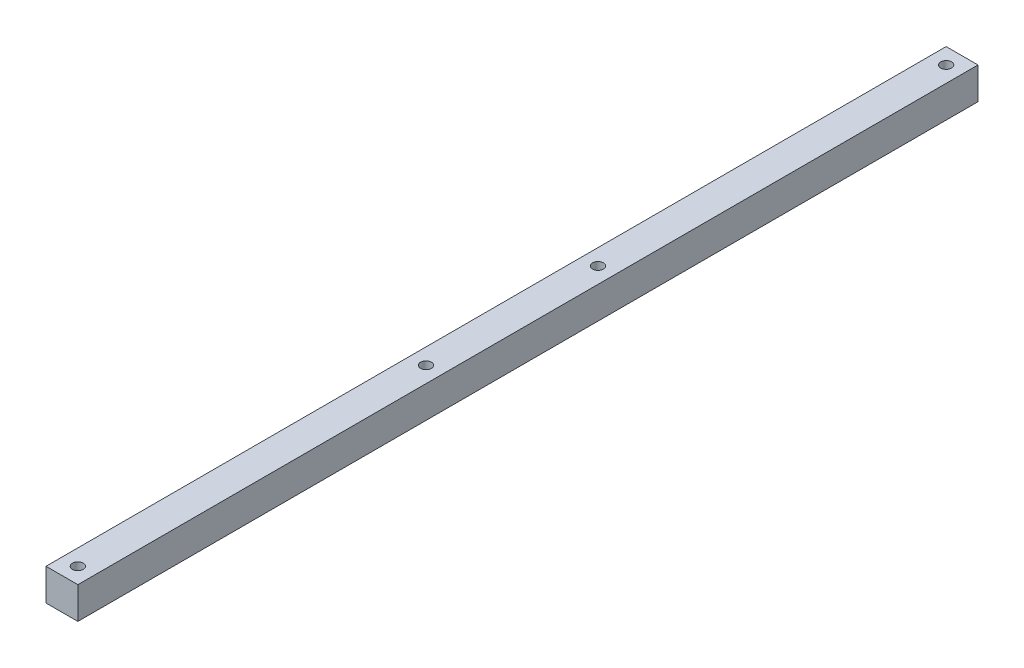
ISO-10303-21;
HEADER;
FILE_DESCRIPTION(('STEP AP214'),'2;1');
FILE_NAME('part.step','',(''),(''),'','','');
FILE_SCHEMA(('AUTOMOTIVE_DESIGN { 1 0 10303 214 1 1 1 1 }'));
ENDSEC;
DATA;
#1=APPLICATION_CONTEXT('core data for automotive mechanical design processes');
#2=APPLICATION_PROTOCOL_DEFINITION('international standard','automotive_design',2000,#1);
#3=PRODUCT_CONTEXT('',#1,'mechanical');
#4=PRODUCT('Part','Part','',(#3));
#5=PRODUCT_RELATED_PRODUCT_CATEGORY('part','',(#4));
#6=PRODUCT_DEFINITION_FORMATION('','',#4);
#7=PRODUCT_DEFINITION_CONTEXT('part definition',#1,'design');
#8=PRODUCT_DEFINITION('design','',#6,#7);
#9=PRODUCT_DEFINITION_SHAPE('','',#8);
#10=(LENGTH_UNIT() NAMED_UNIT(*) SI_UNIT(.MILLI.,.METRE.));
#11=(NAMED_UNIT(*) PLANE_ANGLE_UNIT() SI_UNIT($,.RADIAN.));
#12=(NAMED_UNIT(*) SI_UNIT($,.STERADIAN.) SOLID_ANGLE_UNIT());
#13=UNCERTAINTY_MEASURE_WITH_UNIT(LENGTH_MEASURE(1.E-05),#10,'distance_accuracy_value','');
#14=(GEOMETRIC_REPRESENTATION_CONTEXT(3) GLOBAL_UNCERTAINTY_ASSIGNED_CONTEXT((#13)) GLOBAL_UNIT_ASSIGNED_CONTEXT((#10,
#11,#12)) REPRESENTATION_CONTEXT('',''));
#15=CARTESIAN_POINT('',(0.,0.,0.));
#16=DIRECTION('',(0.,0.,1.));
#17=DIRECTION('',(1.,0.,0.));
#18=AXIS2_PLACEMENT_3D('',#15,#16,#17);
#19=CARTESIAN_POINT('',(2.5,-2.5,141.3));
#20=DIRECTION('',(-1.,0.,0.));
#21=DIRECTION('',(0.,0.,1.));
#22=AXIS2_PLACEMENT_3D('',#19,#20,#21);
#23=PLANE('',#22);
#24=DIRECTION('',(0.,1.,0.));
#25=VECTOR('',#24,1.);
#26=CARTESIAN_POINT('',(2.5,-2.5,0.));
#27=LINE('',#26,#25);
#28=CARTESIAN_POINT('',(2.5,-2.5,0.));
#29=VERTEX_POINT('',#28);
#30=CARTESIAN_POINT('',(2.5,2.5,0.));
#31=VERTEX_POINT('',#30);
#32=EDGE_CURVE('E107',#29,#31,#27,.T.);
#33=ORIENTED_EDGE('',*,*,#32,.T.);
#34=DIRECTION('',(0.,0.,-1.));
#35=VECTOR('',#34,1.);
#36=CARTESIAN_POINT('',(2.5,2.5,141.3));
#37=LINE('',#36,#35);
#38=CARTESIAN_POINT('',(2.5,2.5,141.3));
#39=VERTEX_POINT('',#38);
#40=EDGE_CURVE('E11',#39,#31,#37,.T.);
#41=ORIENTED_EDGE('',*,*,#40,.F.);
#42=DIRECTION('',(0.,1.,0.));
#43=VECTOR('',#42,1.);
#44=CARTESIAN_POINT('',(2.5,-2.5,141.3));
#45=LINE('',#44,#43);
#46=CARTESIAN_POINT('',(2.5,-2.5,141.3));
#47=VERTEX_POINT('',#46);
#48=EDGE_CURVE('E91',#47,#39,#45,.T.);
#49=ORIENTED_EDGE('',*,*,#48,.F.);
#50=DIRECTION('',(0.,0.,-1.));
#51=VECTOR('',#50,1.);
#52=CARTESIAN_POINT('',(2.5,-2.5,141.3));
#53=LINE('',#52,#51);
#54=EDGE_CURVE('E103',#47,#29,#53,.T.);
#55=ORIENTED_EDGE('',*,*,#54,.T.);
#56=EDGE_LOOP('',(#33,#41,#49,#55));
#57=FACE_BOUND('',#56,.T.);
#58=ADVANCED_FACE('F39',(#57),#23,.F.);
#59=CARTESIAN_POINT('',(-2.5,2.5,141.3));
#60=DIRECTION('',(0.,-1.,0.));
#61=DIRECTION('',(0.,0.,-1.));
#62=AXIS2_PLACEMENT_3D('',#59,#60,#61);
#63=PLANE('',#62);
#64=CARTESIAN_POINT('',(0.,2.5,138.8));
#65=DIRECTION('',(0.,-1.,0.));
#66=DIRECTION('',(0.,0.,-1.));
#67=AXIS2_PLACEMENT_3D('',#64,#65,#66);
#68=CIRCLE('',#67,0.849999999999994);
#69=CARTESIAN_POINT('',(0.,2.5,137.95));
#70=VERTEX_POINT('',#69);
#71=EDGE_CURVE('E111',#70,#70,#68,.T.);
#72=ORIENTED_EDGE('',*,*,#71,.T.);
#73=EDGE_LOOP('',(#72));
#74=FACE_BOUND('',#73,.T.);
#75=CARTESIAN_POINT('',(0.,2.5,57.15));
#76=DIRECTION('',(0.,-1.,0.));
#77=DIRECTION('',(0.,0.,1.));
#78=AXIS2_PLACEMENT_3D('',#75,#76,#77);
#79=CIRCLE('',#78,0.850000000000002);
#80=CARTESIAN_POINT('',(0.,2.5,58.));
#81=VERTEX_POINT('',#80);
#82=EDGE_CURVE('E133',#81,#81,#79,.T.);
#83=ORIENTED_EDGE('',*,*,#82,.T.);
#84=EDGE_LOOP('',(#83));
#85=FACE_BOUND('',#84,.T.);
#86=CARTESIAN_POINT('',(0.,2.5,84.15));
#87=DIRECTION('',(0.,-1.,0.));
#88=DIRECTION('',(0.,0.,-1.));
#89=AXIS2_PLACEMENT_3D('',#86,#87,#88);
#90=CIRCLE('',#89,0.850000000000002);
#91=CARTESIAN_POINT('',(0.,2.5,83.3));
#92=VERTEX_POINT('',#91);
#93=EDGE_CURVE('E132',#92,#92,#90,.T.);
#94=ORIENTED_EDGE('',*,*,#93,.T.);
#95=EDGE_LOOP('',(#94));
#96=FACE_BOUND('',#95,.T.);
#97=CARTESIAN_POINT('',(0.,2.5,2.5));
#98=DIRECTION('',(0.,-1.,0.));
#99=DIRECTION('',(0.,0.,1.));
#100=AXIS2_PLACEMENT_3D('',#97,#98,#99);
#101=CIRCLE('',#100,0.849999999999994);
#102=CARTESIAN_POINT('',(0.,2.5,3.35));
#103=VERTEX_POINT('',#102);
#104=EDGE_CURVE('E141',#103,#103,#101,.T.);
#105=ORIENTED_EDGE('',*,*,#104,.T.);
#106=EDGE_LOOP('',(#105));
#107=FACE_BOUND('',#106,.T.);
#108=DIRECTION('',(-1.,0.,0.));
#109=VECTOR('',#108,1.);
#110=CARTESIAN_POINT('',(-2.5,2.5,0.));
#111=LINE('',#110,#109);
#112=CARTESIAN_POINT('',(-2.5,2.5,0.));
#113=VERTEX_POINT('',#112);
#114=EDGE_CURVE('E96',#31,#113,#111,.T.);
#115=ORIENTED_EDGE('',*,*,#114,.T.);
#116=DIRECTION('',(0.,0.,-1.));
#117=VECTOR('',#116,1.);
#118=CARTESIAN_POINT('',(-2.5,2.5,141.3));
#119=LINE('',#118,#117);
#120=CARTESIAN_POINT('',(-2.5,2.5,141.3));
#121=VERTEX_POINT('',#120);
#122=EDGE_CURVE('E48',#121,#113,#119,.T.);
#123=ORIENTED_EDGE('',*,*,#122,.F.);
#124=DIRECTION('',(-1.,0.,0.));
#125=VECTOR('',#124,1.);
#126=CARTESIAN_POINT('',(-2.5,2.5,141.3));
#127=LINE('',#126,#125);
#128=EDGE_CURVE('E86',#39,#121,#127,.T.);
#129=ORIENTED_EDGE('',*,*,#128,.F.);
#130=ORIENTED_EDGE('',*,*,#40,.T.);
#131=EDGE_LOOP('',(#115,#123,#129,#130));
#132=FACE_BOUND('',#131,.T.);
#133=ADVANCED_FACE('F95',(#74,#85,#96,#107,#132),#63,.F.);
#134=CARTESIAN_POINT('',(-2.5,-2.5,141.3));
#135=DIRECTION('',(1.,0.,0.));
#136=DIRECTION('',(0.,0.,-1.));
#137=AXIS2_PLACEMENT_3D('',#134,#135,#136);
#138=PLANE('',#137);
#139=DIRECTION('',(0.,-1.,0.));
#140=VECTOR('',#139,1.);
#141=CARTESIAN_POINT('',(-2.5,-2.5,0.));
#142=LINE('',#141,#140);
#143=CARTESIAN_POINT('',(-2.5,-2.5,0.));
#144=VERTEX_POINT('',#143);
#145=EDGE_CURVE('E73',#113,#144,#142,.T.);
#146=ORIENTED_EDGE('',*,*,#145,.T.);
#147=DIRECTION('',(0.,0.,-1.));
#148=VECTOR('',#147,1.);
#149=CARTESIAN_POINT('',(-2.5,-2.5,141.3));
#150=LINE('',#149,#148);
#151=CARTESIAN_POINT('',(-2.5,-2.5,141.3));
#152=VERTEX_POINT('',#151);
#153=EDGE_CURVE('E98',#152,#144,#150,.T.);
#154=ORIENTED_EDGE('',*,*,#153,.F.);
#155=DIRECTION('',(0.,-1.,0.));
#156=VECTOR('',#155,1.);
#157=CARTESIAN_POINT('',(-2.5,-2.5,141.3));
#158=LINE('',#157,#156);
#159=EDGE_CURVE('E89',#121,#152,#158,.T.);
#160=ORIENTED_EDGE('',*,*,#159,.F.);
#161=ORIENTED_EDGE('',*,*,#122,.T.);
#162=EDGE_LOOP('',(#146,#154,#160,#161));
#163=FACE_BOUND('',#162,.T.);
#164=ADVANCED_FACE('F99',(#163),#138,.F.);
#165=CARTESIAN_POINT('',(-2.5,-2.5,141.3));
#166=DIRECTION('',(0.,1.,0.));
#167=DIRECTION('',(0.,0.,1.));
#168=AXIS2_PLACEMENT_3D('',#165,#166,#167);
#169=PLANE('',#168);
#170=CARTESIAN_POINT('',(0.,-2.5,138.8));
#171=DIRECTION('',(0.,-1.,0.));
#172=DIRECTION('',(0.,0.,-1.));
#173=AXIS2_PLACEMENT_3D('',#170,#171,#172);
#174=CIRCLE('',#173,0.849999999999994);
#175=CARTESIAN_POINT('',(0.,-2.5,137.95));
#176=VERTEX_POINT('',#175);
#177=EDGE_CURVE('E145',#176,#176,#174,.T.);
#178=ORIENTED_EDGE('',*,*,#177,.F.);
#179=EDGE_LOOP('',(#178));
#180=FACE_BOUND('',#179,.T.);
#181=CARTESIAN_POINT('',(0.,-2.5,57.15));
#182=DIRECTION('',(0.,-1.,0.));
#183=DIRECTION('',(0.,0.,1.));
#184=AXIS2_PLACEMENT_3D('',#181,#182,#183);
#185=CIRCLE('',#184,0.850000000000002);
#186=CARTESIAN_POINT('',(0.,-2.5,58.));
#187=VERTEX_POINT('',#186);
#188=EDGE_CURVE('E146',#187,#187,#185,.T.);
#189=ORIENTED_EDGE('',*,*,#188,.F.);
#190=EDGE_LOOP('',(#189));
#191=FACE_BOUND('',#190,.T.);
#192=CARTESIAN_POINT('',(0.,-2.5,84.15));
#193=DIRECTION('',(0.,-1.,0.));
#194=DIRECTION('',(0.,0.,-1.));
#195=AXIS2_PLACEMENT_3D('',#192,#193,#194);
#196=CIRCLE('',#195,0.850000000000002);
#197=CARTESIAN_POINT('',(0.,-2.5,83.3));
#198=VERTEX_POINT('',#197);
#199=EDGE_CURVE('E128',#198,#198,#196,.T.);
#200=ORIENTED_EDGE('',*,*,#199,.F.);
#201=EDGE_LOOP('',(#200));
#202=FACE_BOUND('',#201,.T.);
#203=CARTESIAN_POINT('',(0.,-2.5,2.5));
#204=DIRECTION('',(0.,-1.,0.));
#205=DIRECTION('',(0.,0.,1.));
#206=AXIS2_PLACEMENT_3D('',#203,#204,#205);
#207=CIRCLE('',#206,0.849999999999994);
#208=CARTESIAN_POINT('',(0.,-2.5,3.35));
#209=VERTEX_POINT('',#208);
#210=EDGE_CURVE('E137',#209,#209,#207,.T.);
#211=ORIENTED_EDGE('',*,*,#210,.F.);
#212=EDGE_LOOP('',(#211));
#213=FACE_BOUND('',#212,.T.);
#214=DIRECTION('',(1.,0.,0.));
#215=VECTOR('',#214,1.);
#216=CARTESIAN_POINT('',(-2.5,-2.5,0.));
#217=LINE('',#216,#215);
#218=EDGE_CURVE('E79',#144,#29,#217,.T.);
#219=ORIENTED_EDGE('',*,*,#218,.T.);
#220=ORIENTED_EDGE('',*,*,#54,.F.);
#221=DIRECTION('',(1.,0.,0.));
#222=VECTOR('',#221,1.);
#223=CARTESIAN_POINT('',(-2.5,-2.5,141.3));
#224=LINE('',#223,#222);
#225=EDGE_CURVE('E56',#152,#47,#224,.T.);
#226=ORIENTED_EDGE('',*,*,#225,.F.);
#227=ORIENTED_EDGE('',*,*,#153,.T.);
#228=EDGE_LOOP('',(#219,#220,#226,#227));
#229=FACE_BOUND('',#228,.T.);
#230=ADVANCED_FACE('F121',(#180,#191,#202,#213,#229),#169,.F.);
#231=CARTESIAN_POINT('',(0.,0.,141.3));
#232=DIRECTION('',(0.,0.,-1.));
#233=DIRECTION('',(-1.,0.,0.));
#234=AXIS2_PLACEMENT_3D('',#231,#232,#233);
#235=PLANE('',#234);
#236=ORIENTED_EDGE('',*,*,#48,.T.);
#237=ORIENTED_EDGE('',*,*,#128,.T.);
#238=ORIENTED_EDGE('',*,*,#159,.T.);
#239=ORIENTED_EDGE('',*,*,#225,.T.);
#240=EDGE_LOOP('',(#236,#237,#238,#239));
#241=FACE_BOUND('',#240,.T.);
#242=ADVANCED_FACE('F87',(#241),#235,.F.);
#243=CARTESIAN_POINT('',(0.,0.,0.));
#244=DIRECTION('',(0.,0.,-1.));
#245=DIRECTION('',(-1.,0.,0.));
#246=AXIS2_PLACEMENT_3D('',#243,#244,#245);
#247=PLANE('',#246);
#248=ORIENTED_EDGE('',*,*,#32,.F.);
#249=ORIENTED_EDGE('',*,*,#218,.F.);
#250=ORIENTED_EDGE('',*,*,#145,.F.);
#251=ORIENTED_EDGE('',*,*,#114,.F.);
#252=EDGE_LOOP('',(#248,#249,#250,#251));
#253=FACE_BOUND('',#252,.T.);
#254=ADVANCED_FACE('F124',(#253),#247,.T.);
#255=CARTESIAN_POINT('',(0.,2.5,2.5));
#256=DIRECTION('',(0.,-1.,0.));
#257=DIRECTION('',(0.,0.,-1.));
#258=AXIS2_PLACEMENT_3D('',#255,#256,#257);
#259=CYLINDRICAL_SURFACE('',#258,0.849999999999994);
#260=ORIENTED_EDGE('',*,*,#104,.F.);
#261=EDGE_LOOP('',(#260));
#262=FACE_BOUND('',#261,.T.);
#263=ORIENTED_EDGE('',*,*,#210,.T.);
#264=EDGE_LOOP('',(#263));
#265=FACE_BOUND('',#264,.T.);
#266=ADVANCED_FACE('F178',(#262,#265),#259,.F.);
#267=CARTESIAN_POINT('',(0.,2.5,84.15));
#268=DIRECTION('',(0.,-1.,0.));
#269=DIRECTION('',(0.,0.,-1.));
#270=AXIS2_PLACEMENT_3D('',#267,#268,#269);
#271=CYLINDRICAL_SURFACE('',#270,0.850000000000002);
#272=ORIENTED_EDGE('',*,*,#93,.F.);
#273=EDGE_LOOP('',(#272));
#274=FACE_BOUND('',#273,.T.);
#275=ORIENTED_EDGE('',*,*,#199,.T.);
#276=EDGE_LOOP('',(#275));
#277=FACE_BOUND('',#276,.T.);
#278=ADVANCED_FACE('F180',(#274,#277),#271,.F.);
#279=CARTESIAN_POINT('',(0.,2.5,57.15));
#280=DIRECTION('',(0.,-1.,0.));
#281=DIRECTION('',(0.,0.,-1.));
#282=AXIS2_PLACEMENT_3D('',#279,#280,#281);
#283=CYLINDRICAL_SURFACE('',#282,0.850000000000002);
#284=ORIENTED_EDGE('',*,*,#82,.F.);
#285=EDGE_LOOP('',(#284));
#286=FACE_BOUND('',#285,.T.);
#287=ORIENTED_EDGE('',*,*,#188,.T.);
#288=EDGE_LOOP('',(#287));
#289=FACE_BOUND('',#288,.T.);
#290=ADVANCED_FACE('F165',(#286,#289),#283,.F.);
#291=CARTESIAN_POINT('',(0.,2.5,138.8));
#292=DIRECTION('',(0.,-1.,0.));
#293=DIRECTION('',(0.,0.,-1.));
#294=AXIS2_PLACEMENT_3D('',#291,#292,#293);
#295=CYLINDRICAL_SURFACE('',#294,0.849999999999994);
#296=ORIENTED_EDGE('',*,*,#71,.F.);
#297=EDGE_LOOP('',(#296));
#298=FACE_BOUND('',#297,.T.);
#299=ORIENTED_EDGE('',*,*,#177,.T.);
#300=EDGE_LOOP('',(#299));
#301=FACE_BOUND('',#300,.T.);
#302=ADVANCED_FACE('F162',(#298,#301),#295,.F.);
#303=CLOSED_SHELL('',(#58,#133,#164,#230,#242,#254,#266,#278,#290,#302));
#304=MANIFOLD_SOLID_BREP('B2',#303);
#305=ADVANCED_BREP_SHAPE_REPRESENTATION('',(#18,#304),#14);
#306=SHAPE_DEFINITION_REPRESENTATION(#9,#305);
ENDSEC;
END-ISO-10303-21;
